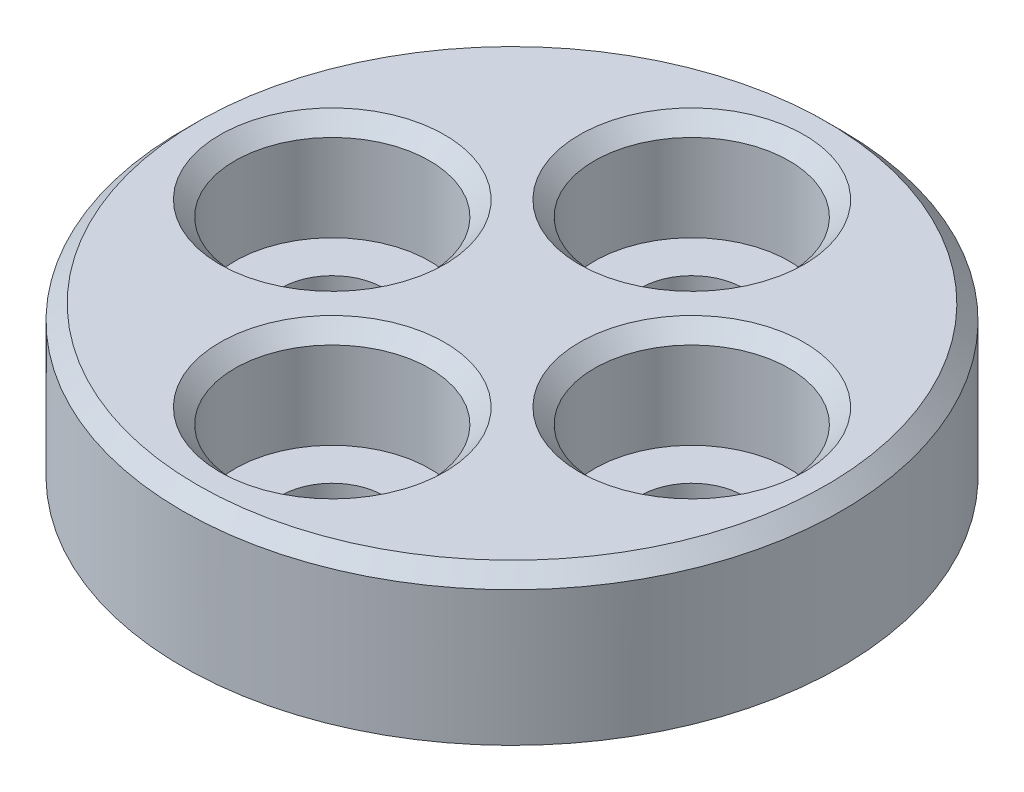
ISO-10303-21;
HEADER;
FILE_DESCRIPTION(('STEP AP214'),'2;1');
FILE_NAME('part.step','',(''),(''),'','','');
FILE_SCHEMA(('AUTOMOTIVE_DESIGN { 1 0 10303 214 1 1 1 1 }'));
ENDSEC;
DATA;
#1=APPLICATION_CONTEXT('core data for automotive mechanical design processes');
#2=APPLICATION_PROTOCOL_DEFINITION('international standard','automotive_design',2000,#1);
#3=PRODUCT_CONTEXT('',#1,'mechanical');
#4=PRODUCT('Part','Part','',(#3));
#5=PRODUCT_RELATED_PRODUCT_CATEGORY('part','',(#4));
#6=PRODUCT_DEFINITION_FORMATION('','',#4);
#7=PRODUCT_DEFINITION_CONTEXT('part definition',#1,'design');
#8=PRODUCT_DEFINITION('design','',#6,#7);
#9=PRODUCT_DEFINITION_SHAPE('','',#8);
#10=(LENGTH_UNIT() NAMED_UNIT(*) SI_UNIT(.MILLI.,.METRE.));
#11=(NAMED_UNIT(*) PLANE_ANGLE_UNIT() SI_UNIT($,.RADIAN.));
#12=(NAMED_UNIT(*) SI_UNIT($,.STERADIAN.) SOLID_ANGLE_UNIT());
#13=UNCERTAINTY_MEASURE_WITH_UNIT(LENGTH_MEASURE(1.E-05),#10,'distance_accuracy_value','');
#14=(GEOMETRIC_REPRESENTATION_CONTEXT(3) GLOBAL_UNCERTAINTY_ASSIGNED_CONTEXT((#13)) GLOBAL_UNIT_ASSIGNED_CONTEXT((#10,
#11,#12)) REPRESENTATION_CONTEXT('',''));
#15=CARTESIAN_POINT('',(0.,0.,0.));
#16=DIRECTION('',(0.,0.,1.));
#17=DIRECTION('',(1.,0.,0.));
#18=AXIS2_PLACEMENT_3D('',#15,#16,#17);
#19=CARTESIAN_POINT('',(0.,0.,0.));
#20=DIRECTION('',(0.,-1.,0.));
#21=DIRECTION('',(0.,0.,-1.));
#22=AXIS2_PLACEMENT_3D('',#19,#20,#21);
#23=PLANE('',#22);
#24=CARTESIAN_POINT('',(6.,0.,0.));
#25=DIRECTION('',(0.,-1.,0.));
#26=DIRECTION('',(0.,0.,-1.));
#27=AXIS2_PLACEMENT_3D('',#24,#25,#26);
#28=CIRCLE('',#27,2.2);
#29=CARTESIAN_POINT('',(6.,0.,-2.2));
#30=VERTEX_POINT('',#29);
#31=EDGE_CURVE('E55',#30,#30,#28,.F.);
#32=ORIENTED_EDGE('',*,*,#31,.T.);
#33=EDGE_LOOP('',(#32));
#34=FACE_BOUND('',#33,.T.);
#35=CARTESIAN_POINT('',(0.,0.,6.));
#36=DIRECTION('',(0.,-1.,0.));
#37=DIRECTION('',(0.,0.,-1.));
#38=AXIS2_PLACEMENT_3D('',#35,#36,#37);
#39=CIRCLE('',#38,2.20000000000001);
#40=CARTESIAN_POINT('',(0.,0.,3.8));
#41=VERTEX_POINT('',#40);
#42=EDGE_CURVE('E60',#41,#41,#39,.F.);
#43=ORIENTED_EDGE('',*,*,#42,.T.);
#44=EDGE_LOOP('',(#43));
#45=FACE_BOUND('',#44,.T.);
#46=CARTESIAN_POINT('',(-6.,0.,0.));
#47=DIRECTION('',(0.,-1.,0.));
#48=DIRECTION('',(0.,0.,-1.));
#49=AXIS2_PLACEMENT_3D('',#46,#47,#48);
#50=CIRCLE('',#49,2.2);
#51=CARTESIAN_POINT('',(-6.,0.,-2.2));
#52=VERTEX_POINT('',#51);
#53=EDGE_CURVE('E63',#52,#52,#50,.F.);
#54=ORIENTED_EDGE('',*,*,#53,.T.);
#55=EDGE_LOOP('',(#54));
#56=FACE_BOUND('',#55,.T.);
#57=CARTESIAN_POINT('',(0.,0.,-6.));
#58=DIRECTION('',(0.,-1.,0.));
#59=DIRECTION('',(0.,0.,-1.));
#60=AXIS2_PLACEMENT_3D('',#57,#58,#59);
#61=CIRCLE('',#60,2.2);
#62=CARTESIAN_POINT('',(0.,0.,-8.2));
#63=VERTEX_POINT('',#62);
#64=EDGE_CURVE('E66',#63,#63,#61,.F.);
#65=ORIENTED_EDGE('',*,*,#64,.T.);
#66=EDGE_LOOP('',(#65));
#67=FACE_BOUND('',#66,.T.);
#68=CARTESIAN_POINT('',(0.,0.,0.));
#69=DIRECTION('',(0.,-1.,0.));
#70=DIRECTION('',(0.,0.,-1.));
#71=AXIS2_PLACEMENT_3D('',#68,#69,#70);
#72=CIRCLE('',#71,11.);
#73=CARTESIAN_POINT('',(0.,0.,-11.));
#74=VERTEX_POINT('',#73);
#75=EDGE_CURVE('E102',#74,#74,#72,.T.);
#76=ORIENTED_EDGE('',*,*,#75,.T.);
#77=EDGE_LOOP('',(#76));
#78=FACE_BOUND('',#77,.T.);
#79=ADVANCED_FACE('F39',(#34,#45,#56,#67,#78),#23,.T.);
#80=CARTESIAN_POINT('',(0.,0.,0.));
#81=DIRECTION('',(0.,-1.,0.));
#82=DIRECTION('',(0.,0.,-1.));
#83=AXIS2_PLACEMENT_3D('',#80,#81,#82);
#84=CYLINDRICAL_SURFACE('',#83,11.);
#85=CARTESIAN_POINT('',(0.,4.5,0.));
#86=DIRECTION('',(0.,1.,0.));
#87=DIRECTION('',(0.,0.,1.));
#88=AXIS2_PLACEMENT_3D('',#85,#86,#87);
#89=CIRCLE('',#88,11.);
#90=CARTESIAN_POINT('',(0.,4.5,11.));
#91=VERTEX_POINT('',#90);
#92=EDGE_CURVE('E99',#91,#91,#89,.F.);
#93=ORIENTED_EDGE('',*,*,#92,.T.);
#94=EDGE_LOOP('',(#93));
#95=FACE_BOUND('',#94,.T.);
#96=ORIENTED_EDGE('',*,*,#75,.F.);
#97=EDGE_LOOP('',(#96));
#98=FACE_BOUND('',#97,.T.);
#99=ADVANCED_FACE('F149',(#95,#98),#84,.T.);
#100=CARTESIAN_POINT('',(11.,5.,0.));
#101=DIRECTION('',(0.,1.,0.));
#102=DIRECTION('',(0.,0.,1.));
#103=AXIS2_PLACEMENT_3D('',#100,#101,#102);
#104=PLANE('',#103);
#105=CARTESIAN_POINT('',(0.,5.,0.));
#106=DIRECTION('',(0.,1.,0.));
#107=DIRECTION('',(0.,0.,1.));
#108=AXIS2_PLACEMENT_3D('',#105,#106,#107);
#109=CIRCLE('',#108,10.5);
#110=CARTESIAN_POINT('',(0.,5.,10.5));
#111=VERTEX_POINT('',#110);
#112=EDGE_CURVE('E84',#111,#111,#109,.T.);
#113=ORIENTED_EDGE('',*,*,#112,.T.);
#114=EDGE_LOOP('',(#113));
#115=FACE_BOUND('',#114,.T.);
#116=CARTESIAN_POINT('',(-6.,5.,0.));
#117=DIRECTION('',(0.,1.,0.));
#118=DIRECTION('',(0.,0.,1.));
#119=AXIS2_PLACEMENT_3D('',#116,#117,#118);
#120=CIRCLE('',#119,3.75);
#121=CARTESIAN_POINT('',(-6.,5.,3.75));
#122=VERTEX_POINT('',#121);
#123=EDGE_CURVE('E87',#122,#122,#120,.F.);
#124=ORIENTED_EDGE('',*,*,#123,.T.);
#125=EDGE_LOOP('',(#124));
#126=FACE_BOUND('',#125,.T.);
#127=CARTESIAN_POINT('',(0.,5.,6.));
#128=DIRECTION('',(0.,1.,0.));
#129=DIRECTION('',(0.,0.,1.));
#130=AXIS2_PLACEMENT_3D('',#127,#128,#129);
#131=CIRCLE('',#130,3.75);
#132=CARTESIAN_POINT('',(0.,5.,9.75));
#133=VERTEX_POINT('',#132);
#134=EDGE_CURVE('E90',#133,#133,#131,.F.);
#135=ORIENTED_EDGE('',*,*,#134,.T.);
#136=EDGE_LOOP('',(#135));
#137=FACE_BOUND('',#136,.T.);
#138=CARTESIAN_POINT('',(6.,5.,0.));
#139=DIRECTION('',(0.,1.,0.));
#140=DIRECTION('',(0.,0.,1.));
#141=AXIS2_PLACEMENT_3D('',#138,#139,#140);
#142=CIRCLE('',#141,3.75);
#143=CARTESIAN_POINT('',(6.,5.,3.75));
#144=VERTEX_POINT('',#143);
#145=EDGE_CURVE('E93',#144,#144,#142,.F.);
#146=ORIENTED_EDGE('',*,*,#145,.T.);
#147=EDGE_LOOP('',(#146));
#148=FACE_BOUND('',#147,.T.);
#149=CARTESIAN_POINT('',(0.,5.,-6.));
#150=DIRECTION('',(0.,1.,0.));
#151=DIRECTION('',(0.,0.,1.));
#152=AXIS2_PLACEMENT_3D('',#149,#150,#151);
#153=CIRCLE('',#152,3.75);
#154=CARTESIAN_POINT('',(0.,5.,-2.25));
#155=VERTEX_POINT('',#154);
#156=EDGE_CURVE('E96',#155,#155,#153,.F.);
#157=ORIENTED_EDGE('',*,*,#156,.T.);
#158=EDGE_LOOP('',(#157));
#159=FACE_BOUND('',#158,.T.);
#160=ADVANCED_FACE('F155',(#115,#126,#137,#148,#159),#104,.T.);
#161=CARTESIAN_POINT('',(-6.,5.,0.));
#162=DIRECTION('',(0.,1.,0.));
#163=DIRECTION('',(0.,0.,1.));
#164=AXIS2_PLACEMENT_3D('',#161,#162,#163);
#165=CYLINDRICAL_SURFACE('',#164,1.7);
#166=CARTESIAN_POINT('',(-6.,0.500000000000002,0.));
#167=DIRECTION('',(0.,-1.,0.));
#168=DIRECTION('',(0.,0.,-1.));
#169=AXIS2_PLACEMENT_3D('',#166,#167,#168);
#170=CIRCLE('',#169,1.7);
#171=CARTESIAN_POINT('',(-6.,0.500000000000002,-1.7));
#172=VERTEX_POINT('',#171);
#173=EDGE_CURVE('E47',#172,#172,#170,.T.);
#174=ORIENTED_EDGE('',*,*,#173,.T.);
#175=EDGE_LOOP('',(#174));
#176=FACE_BOUND('',#175,.T.);
#177=CARTESIAN_POINT('',(-6.,1.6,0.));
#178=DIRECTION('',(0.,1.,0.));
#179=DIRECTION('',(0.,0.,1.));
#180=AXIS2_PLACEMENT_3D('',#177,#178,#179);
#181=CIRCLE('',#180,1.7);
#182=CARTESIAN_POINT('',(-6.,1.6,1.7));
#183=VERTEX_POINT('',#182);
#184=EDGE_CURVE('E105',#183,#183,#181,.T.);
#185=ORIENTED_EDGE('',*,*,#184,.T.);
#186=EDGE_LOOP('',(#185));
#187=FACE_BOUND('',#186,.T.);
#188=ADVANCED_FACE('F370',(#176,#187),#165,.F.);
#189=CARTESIAN_POINT('',(-4.3,1.6,0.));
#190=DIRECTION('',(0.,-1.,0.));
#191=DIRECTION('',(0.,0.,-1.));
#192=AXIS2_PLACEMENT_3D('',#189,#190,#191);
#193=PLANE('',#192);
#194=ORIENTED_EDGE('',*,*,#184,.F.);
#195=EDGE_LOOP('',(#194));
#196=FACE_BOUND('',#195,.T.);
#197=CARTESIAN_POINT('',(-6.,1.6,0.));
#198=DIRECTION('',(0.,1.,0.));
#199=DIRECTION('',(0.,0.,1.));
#200=AXIS2_PLACEMENT_3D('',#197,#198,#199);
#201=CIRCLE('',#200,3.25);
#202=CARTESIAN_POINT('',(-6.,1.6,3.25));
#203=VERTEX_POINT('',#202);
#204=EDGE_CURVE('E108',#203,#203,#201,.T.);
#205=ORIENTED_EDGE('',*,*,#204,.T.);
#206=EDGE_LOOP('',(#205));
#207=FACE_BOUND('',#206,.T.);
#208=ADVANCED_FACE('F360',(#196,#207),#193,.F.);
#209=CARTESIAN_POINT('',(-6.,5.,0.));
#210=DIRECTION('',(0.,1.,0.));
#211=DIRECTION('',(0.,0.,1.));
#212=AXIS2_PLACEMENT_3D('',#209,#210,#211);
#213=CYLINDRICAL_SURFACE('',#212,3.25);
#214=CARTESIAN_POINT('',(-6.,4.5,0.));
#215=DIRECTION('',(0.,1.,0.));
#216=DIRECTION('',(0.,0.,1.));
#217=AXIS2_PLACEMENT_3D('',#214,#215,#216);
#218=CIRCLE('',#217,3.25);
#219=CARTESIAN_POINT('',(-6.,4.5,3.25));
#220=VERTEX_POINT('',#219);
#221=EDGE_CURVE('E81',#220,#220,#218,.T.);
#222=ORIENTED_EDGE('',*,*,#221,.T.);
#223=EDGE_LOOP('',(#222));
#224=FACE_BOUND('',#223,.T.);
#225=ORIENTED_EDGE('',*,*,#204,.F.);
#226=EDGE_LOOP('',(#225));
#227=FACE_BOUND('',#226,.T.);
#228=ADVANCED_FACE('F350',(#224,#227),#213,.F.);
#229=CARTESIAN_POINT('',(0.,5.,6.));
#230=DIRECTION('',(0.,1.,0.));
#231=DIRECTION('',(0.,0.,1.));
#232=AXIS2_PLACEMENT_3D('',#229,#230,#231);
#233=CYLINDRICAL_SURFACE('',#232,1.7);
#234=CARTESIAN_POINT('',(0.,0.500000000000002,6.));
#235=DIRECTION('',(0.,-1.,0.));
#236=DIRECTION('',(0.,0.,-1.));
#237=AXIS2_PLACEMENT_3D('',#234,#235,#236);
#238=CIRCLE('',#237,1.7);
#239=CARTESIAN_POINT('',(0.,0.500000000000002,4.3));
#240=VERTEX_POINT('',#239);
#241=EDGE_CURVE('E51',#240,#240,#238,.T.);
#242=ORIENTED_EDGE('',*,*,#241,.T.);
#243=EDGE_LOOP('',(#242));
#244=FACE_BOUND('',#243,.T.);
#245=CARTESIAN_POINT('',(0.,1.6,6.));
#246=DIRECTION('',(0.,1.,0.));
#247=DIRECTION('',(0.,0.,1.));
#248=AXIS2_PLACEMENT_3D('',#245,#246,#247);
#249=CIRCLE('',#248,1.7);
#250=CARTESIAN_POINT('',(0.,1.6,7.7));
#251=VERTEX_POINT('',#250);
#252=EDGE_CURVE('E111',#251,#251,#249,.T.);
#253=ORIENTED_EDGE('',*,*,#252,.T.);
#254=EDGE_LOOP('',(#253));
#255=FACE_BOUND('',#254,.T.);
#256=ADVANCED_FACE('F340',(#244,#255),#233,.F.);
#257=CARTESIAN_POINT('',(1.7,1.6,6.));
#258=DIRECTION('',(0.,-1.,0.));
#259=DIRECTION('',(0.,0.,-1.));
#260=AXIS2_PLACEMENT_3D('',#257,#258,#259);
#261=PLANE('',#260);
#262=ORIENTED_EDGE('',*,*,#252,.F.);
#263=EDGE_LOOP('',(#262));
#264=FACE_BOUND('',#263,.T.);
#265=CARTESIAN_POINT('',(0.,1.6,6.));
#266=DIRECTION('',(0.,1.,0.));
#267=DIRECTION('',(0.,0.,1.));
#268=AXIS2_PLACEMENT_3D('',#265,#266,#267);
#269=CIRCLE('',#268,3.25);
#270=CARTESIAN_POINT('',(0.,1.6,9.25));
#271=VERTEX_POINT('',#270);
#272=EDGE_CURVE('E114',#271,#271,#269,.T.);
#273=ORIENTED_EDGE('',*,*,#272,.T.);
#274=EDGE_LOOP('',(#273));
#275=FACE_BOUND('',#274,.T.);
#276=ADVANCED_FACE('F330',(#264,#275),#261,.F.);
#277=CARTESIAN_POINT('',(0.,5.,6.));
#278=DIRECTION('',(0.,1.,0.));
#279=DIRECTION('',(0.,0.,1.));
#280=AXIS2_PLACEMENT_3D('',#277,#278,#279);
#281=CYLINDRICAL_SURFACE('',#280,3.25);
#282=CARTESIAN_POINT('',(0.,4.5,6.));
#283=DIRECTION('',(0.,1.,0.));
#284=DIRECTION('',(0.,0.,1.));
#285=AXIS2_PLACEMENT_3D('',#282,#283,#284);
#286=CIRCLE('',#285,3.25);
#287=CARTESIAN_POINT('',(0.,4.5,9.25));
#288=VERTEX_POINT('',#287);
#289=EDGE_CURVE('E78',#288,#288,#286,.T.);
#290=ORIENTED_EDGE('',*,*,#289,.T.);
#291=EDGE_LOOP('',(#290));
#292=FACE_BOUND('',#291,.T.);
#293=ORIENTED_EDGE('',*,*,#272,.F.);
#294=EDGE_LOOP('',(#293));
#295=FACE_BOUND('',#294,.T.);
#296=ADVANCED_FACE('F320',(#292,#295),#281,.F.);
#297=CARTESIAN_POINT('',(6.,5.,0.));
#298=DIRECTION('',(0.,1.,0.));
#299=DIRECTION('',(0.,0.,1.));
#300=AXIS2_PLACEMENT_3D('',#297,#298,#299);
#301=CYLINDRICAL_SURFACE('',#300,1.7);
#302=CARTESIAN_POINT('',(6.,0.500000000000002,0.));
#303=DIRECTION('',(0.,-1.,0.));
#304=DIRECTION('',(0.,0.,-1.));
#305=AXIS2_PLACEMENT_3D('',#302,#303,#304);
#306=CIRCLE('',#305,1.7);
#307=CARTESIAN_POINT('',(6.,0.500000000000002,-1.7));
#308=VERTEX_POINT('',#307);
#309=EDGE_CURVE('E69',#308,#308,#306,.T.);
#310=ORIENTED_EDGE('',*,*,#309,.T.);
#311=EDGE_LOOP('',(#310));
#312=FACE_BOUND('',#311,.T.);
#313=CARTESIAN_POINT('',(6.,1.6,0.));
#314=DIRECTION('',(0.,1.,0.));
#315=DIRECTION('',(0.,0.,1.));
#316=AXIS2_PLACEMENT_3D('',#313,#314,#315);
#317=CIRCLE('',#316,1.7);
#318=CARTESIAN_POINT('',(6.,1.6,1.7));
#319=VERTEX_POINT('',#318);
#320=EDGE_CURVE('E117',#319,#319,#317,.T.);
#321=ORIENTED_EDGE('',*,*,#320,.T.);
#322=EDGE_LOOP('',(#321));
#323=FACE_BOUND('',#322,.T.);
#324=ADVANCED_FACE('F310',(#312,#323),#301,.F.);
#325=CARTESIAN_POINT('',(7.7,1.6,0.));
#326=DIRECTION('',(0.,-1.,0.));
#327=DIRECTION('',(0.,0.,-1.));
#328=AXIS2_PLACEMENT_3D('',#325,#326,#327);
#329=PLANE('',#328);
#330=ORIENTED_EDGE('',*,*,#320,.F.);
#331=EDGE_LOOP('',(#330));
#332=FACE_BOUND('',#331,.T.);
#333=CARTESIAN_POINT('',(6.,1.6,0.));
#334=DIRECTION('',(0.,1.,0.));
#335=DIRECTION('',(0.,0.,1.));
#336=AXIS2_PLACEMENT_3D('',#333,#334,#335);
#337=CIRCLE('',#336,3.25);
#338=CARTESIAN_POINT('',(6.,1.6,3.25));
#339=VERTEX_POINT('',#338);
#340=EDGE_CURVE('E120',#339,#339,#337,.T.);
#341=ORIENTED_EDGE('',*,*,#340,.T.);
#342=EDGE_LOOP('',(#341));
#343=FACE_BOUND('',#342,.T.);
#344=ADVANCED_FACE('F300',(#332,#343),#329,.F.);
#345=CARTESIAN_POINT('',(6.,5.,0.));
#346=DIRECTION('',(0.,1.,0.));
#347=DIRECTION('',(0.,0.,1.));
#348=AXIS2_PLACEMENT_3D('',#345,#346,#347);
#349=CYLINDRICAL_SURFACE('',#348,3.25);
#350=CARTESIAN_POINT('',(6.,4.5,0.));
#351=DIRECTION('',(0.,1.,0.));
#352=DIRECTION('',(0.,0.,1.));
#353=AXIS2_PLACEMENT_3D('',#350,#351,#352);
#354=CIRCLE('',#353,3.25);
#355=CARTESIAN_POINT('',(6.,4.5,3.25));
#356=VERTEX_POINT('',#355);
#357=EDGE_CURVE('E75',#356,#356,#354,.T.);
#358=ORIENTED_EDGE('',*,*,#357,.T.);
#359=EDGE_LOOP('',(#358));
#360=FACE_BOUND('',#359,.T.);
#361=ORIENTED_EDGE('',*,*,#340,.F.);
#362=EDGE_LOOP('',(#361));
#363=FACE_BOUND('',#362,.T.);
#364=ADVANCED_FACE('F291',(#360,#363),#349,.F.);
#365=CARTESIAN_POINT('',(0.,5.,-6.));
#366=DIRECTION('',(0.,1.,0.));
#367=DIRECTION('',(0.,0.,1.));
#368=AXIS2_PLACEMENT_3D('',#365,#366,#367);
#369=CYLINDRICAL_SURFACE('',#368,1.7);
#370=CARTESIAN_POINT('',(0.,0.500000000000002,-6.));
#371=DIRECTION('',(0.,-1.,0.));
#372=DIRECTION('',(0.,0.,-1.));
#373=AXIS2_PLACEMENT_3D('',#370,#371,#372);
#374=CIRCLE('',#373,1.7);
#375=CARTESIAN_POINT('',(0.,0.500000000000002,-7.7));
#376=VERTEX_POINT('',#375);
#377=EDGE_CURVE('E10',#376,#376,#374,.T.);
#378=ORIENTED_EDGE('',*,*,#377,.T.);
#379=EDGE_LOOP('',(#378));
#380=FACE_BOUND('',#379,.T.);
#381=CARTESIAN_POINT('',(0.,1.6,-6.));
#382=DIRECTION('',(0.,1.,0.));
#383=DIRECTION('',(0.,0.,1.));
#384=AXIS2_PLACEMENT_3D('',#381,#382,#383);
#385=CIRCLE('',#384,1.7);
#386=CARTESIAN_POINT('',(0.,1.6,-4.3));
#387=VERTEX_POINT('',#386);
#388=EDGE_CURVE('E123',#387,#387,#385,.T.);
#389=ORIENTED_EDGE('',*,*,#388,.T.);
#390=EDGE_LOOP('',(#389));
#391=FACE_BOUND('',#390,.T.);
#392=ADVANCED_FACE('F145',(#380,#391),#369,.F.);
#393=CARTESIAN_POINT('',(1.7,1.6,-6.));
#394=DIRECTION('',(0.,-1.,0.));
#395=DIRECTION('',(0.,0.,-1.));
#396=AXIS2_PLACEMENT_3D('',#393,#394,#395);
#397=PLANE('',#396);
#398=ORIENTED_EDGE('',*,*,#388,.F.);
#399=EDGE_LOOP('',(#398));
#400=FACE_BOUND('',#399,.T.);
#401=CARTESIAN_POINT('',(0.,1.6,-6.));
#402=DIRECTION('',(0.,1.,0.));
#403=DIRECTION('',(0.,0.,1.));
#404=AXIS2_PLACEMENT_3D('',#401,#402,#403);
#405=CIRCLE('',#404,3.25);
#406=CARTESIAN_POINT('',(0.,1.6,-2.75));
#407=VERTEX_POINT('',#406);
#408=EDGE_CURVE('E126',#407,#407,#405,.T.);
#409=ORIENTED_EDGE('',*,*,#408,.T.);
#410=EDGE_LOOP('',(#409));
#411=FACE_BOUND('',#410,.T.);
#412=ADVANCED_FACE('F130',(#400,#411),#397,.F.);
#413=CARTESIAN_POINT('',(0.,5.,-6.));
#414=DIRECTION('',(0.,1.,0.));
#415=DIRECTION('',(0.,0.,1.));
#416=AXIS2_PLACEMENT_3D('',#413,#414,#415);
#417=CYLINDRICAL_SURFACE('',#416,3.25);
#418=CARTESIAN_POINT('',(0.,4.5,-6.));
#419=DIRECTION('',(0.,1.,0.));
#420=DIRECTION('',(0.,0.,1.));
#421=AXIS2_PLACEMENT_3D('',#418,#419,#420);
#422=CIRCLE('',#421,3.25);
#423=CARTESIAN_POINT('',(0.,4.5,-2.75));
#424=VERTEX_POINT('',#423);
#425=EDGE_CURVE('E72',#424,#424,#422,.T.);
#426=ORIENTED_EDGE('',*,*,#425,.T.);
#427=EDGE_LOOP('',(#426));
#428=FACE_BOUND('',#427,.T.);
#429=ORIENTED_EDGE('',*,*,#408,.F.);
#430=EDGE_LOOP('',(#429));
#431=FACE_BOUND('',#430,.T.);
#432=ADVANCED_FACE('F132',(#428,#431),#417,.F.);
#433=CARTESIAN_POINT('',(0.,4.5,0.));
#434=DIRECTION('',(0.,-1.,0.));
#435=DIRECTION('',(0.,0.,-1.));
#436=AXIS2_PLACEMENT_3D('',#433,#434,#435);
#437=CONICAL_SURFACE('',#436,11.,0.78539816339745);
#438=ORIENTED_EDGE('',*,*,#112,.F.);
#439=EDGE_LOOP('',(#438));
#440=FACE_BOUND('',#439,.T.);
#441=ORIENTED_EDGE('',*,*,#92,.F.);
#442=EDGE_LOOP('',(#441));
#443=FACE_BOUND('',#442,.T.);
#444=ADVANCED_FACE('F134',(#440,#443),#437,.T.);
#445=CARTESIAN_POINT('',(-6.,4.5,0.));
#446=DIRECTION('',(0.,1.,0.));
#447=DIRECTION('',(0.,0.,1.));
#448=AXIS2_PLACEMENT_3D('',#445,#446,#447);
#449=CONICAL_SURFACE('',#448,3.25,0.78539816339745);
#450=ORIENTED_EDGE('',*,*,#123,.F.);
#451=EDGE_LOOP('',(#450));
#452=FACE_BOUND('',#451,.T.);
#453=ORIENTED_EDGE('',*,*,#221,.F.);
#454=EDGE_LOOP('',(#453));
#455=FACE_BOUND('',#454,.T.);
#456=ADVANCED_FACE('F141',(#452,#455),#449,.F.);
#457=CARTESIAN_POINT('',(0.,4.5,6.));
#458=DIRECTION('',(0.,1.,0.));
#459=DIRECTION('',(0.,0.,1.));
#460=AXIS2_PLACEMENT_3D('',#457,#458,#459);
#461=CONICAL_SURFACE('',#460,3.25,0.78539816339745);
#462=ORIENTED_EDGE('',*,*,#134,.F.);
#463=EDGE_LOOP('',(#462));
#464=FACE_BOUND('',#463,.T.);
#465=ORIENTED_EDGE('',*,*,#289,.F.);
#466=EDGE_LOOP('',(#465));
#467=FACE_BOUND('',#466,.T.);
#468=ADVANCED_FACE('F170',(#464,#467),#461,.F.);
#469=CARTESIAN_POINT('',(6.,4.5,0.));
#470=DIRECTION('',(0.,1.,0.));
#471=DIRECTION('',(0.,0.,1.));
#472=AXIS2_PLACEMENT_3D('',#469,#470,#471);
#473=CONICAL_SURFACE('',#472,3.25,0.785398163397451);
#474=ORIENTED_EDGE('',*,*,#145,.F.);
#475=EDGE_LOOP('',(#474));
#476=FACE_BOUND('',#475,.T.);
#477=ORIENTED_EDGE('',*,*,#357,.F.);
#478=EDGE_LOOP('',(#477));
#479=FACE_BOUND('',#478,.T.);
#480=ADVANCED_FACE('F177',(#476,#479),#473,.F.);
#481=CARTESIAN_POINT('',(0.,4.5,-6.));
#482=DIRECTION('',(0.,1.,0.));
#483=DIRECTION('',(0.,0.,1.));
#484=AXIS2_PLACEMENT_3D('',#481,#482,#483);
#485=CONICAL_SURFACE('',#484,3.25,0.785398163397451);
#486=ORIENTED_EDGE('',*,*,#156,.F.);
#487=EDGE_LOOP('',(#486));
#488=FACE_BOUND('',#487,.T.);
#489=ORIENTED_EDGE('',*,*,#425,.F.);
#490=EDGE_LOOP('',(#489));
#491=FACE_BOUND('',#490,.T.);
#492=ADVANCED_FACE('F184',(#488,#491),#485,.F.);
#493=CARTESIAN_POINT('',(6.,0.500000000000002,0.));
#494=DIRECTION('',(0.,-1.,0.));
#495=DIRECTION('',(0.,0.,-1.));
#496=AXIS2_PLACEMENT_3D('',#493,#494,#495);
#497=CONICAL_SURFACE('',#496,1.7,0.785398163397453);
#498=ORIENTED_EDGE('',*,*,#31,.F.);
#499=EDGE_LOOP('',(#498));
#500=FACE_BOUND('',#499,.T.);
#501=ORIENTED_EDGE('',*,*,#309,.F.);
#502=EDGE_LOOP('',(#501));
#503=FACE_BOUND('',#502,.T.);
#504=ADVANCED_FACE('F191',(#500,#503),#497,.F.);
#505=CARTESIAN_POINT('',(0.,0.500000000000002,6.));
#506=DIRECTION('',(0.,-1.,0.));
#507=DIRECTION('',(0.,0.,-1.));
#508=AXIS2_PLACEMENT_3D('',#505,#506,#507);
#509=CONICAL_SURFACE('',#508,1.7,0.785398163397453);
#510=ORIENTED_EDGE('',*,*,#42,.F.);
#511=EDGE_LOOP('',(#510));
#512=FACE_BOUND('',#511,.T.);
#513=ORIENTED_EDGE('',*,*,#241,.F.);
#514=EDGE_LOOP('',(#513));
#515=FACE_BOUND('',#514,.T.);
#516=ADVANCED_FACE('F198',(#512,#515),#509,.F.);
#517=CARTESIAN_POINT('',(-6.,0.500000000000002,0.));
#518=DIRECTION('',(0.,-1.,0.));
#519=DIRECTION('',(0.,0.,-1.));
#520=AXIS2_PLACEMENT_3D('',#517,#518,#519);
#521=CONICAL_SURFACE('',#520,1.7,0.785398163397453);
#522=ORIENTED_EDGE('',*,*,#53,.F.);
#523=EDGE_LOOP('',(#522));
#524=FACE_BOUND('',#523,.T.);
#525=ORIENTED_EDGE('',*,*,#173,.F.);
#526=EDGE_LOOP('',(#525));
#527=FACE_BOUND('',#526,.T.);
#528=ADVANCED_FACE('F204',(#524,#527),#521,.F.);
#529=CARTESIAN_POINT('',(0.,0.500000000000002,-6.));
#530=DIRECTION('',(0.,-1.,0.));
#531=DIRECTION('',(0.,0.,-1.));
#532=AXIS2_PLACEMENT_3D('',#529,#530,#531);
#533=CONICAL_SURFACE('',#532,1.7,0.785398163397453);
#534=ORIENTED_EDGE('',*,*,#64,.F.);
#535=EDGE_LOOP('',(#534));
#536=FACE_BOUND('',#535,.T.);
#537=ORIENTED_EDGE('',*,*,#377,.F.);
#538=EDGE_LOOP('',(#537));
#539=FACE_BOUND('',#538,.T.);
#540=ADVANCED_FACE('F42',(#536,#539),#533,.F.);
#541=CLOSED_SHELL('',(#79,#99,#160,#188,#208,#228,#256,#276,#296,#324,#344,#364,#392,#412,#432,
#444,#456,#468,#480,#492,#504,#516,#528,#540));
#542=MANIFOLD_SOLID_BREP('B2',#541);
#543=ADVANCED_BREP_SHAPE_REPRESENTATION('',(#18,#542),#14);
#544=SHAPE_DEFINITION_REPRESENTATION(#9,#543);
ENDSEC;
END-ISO-10303-21;
